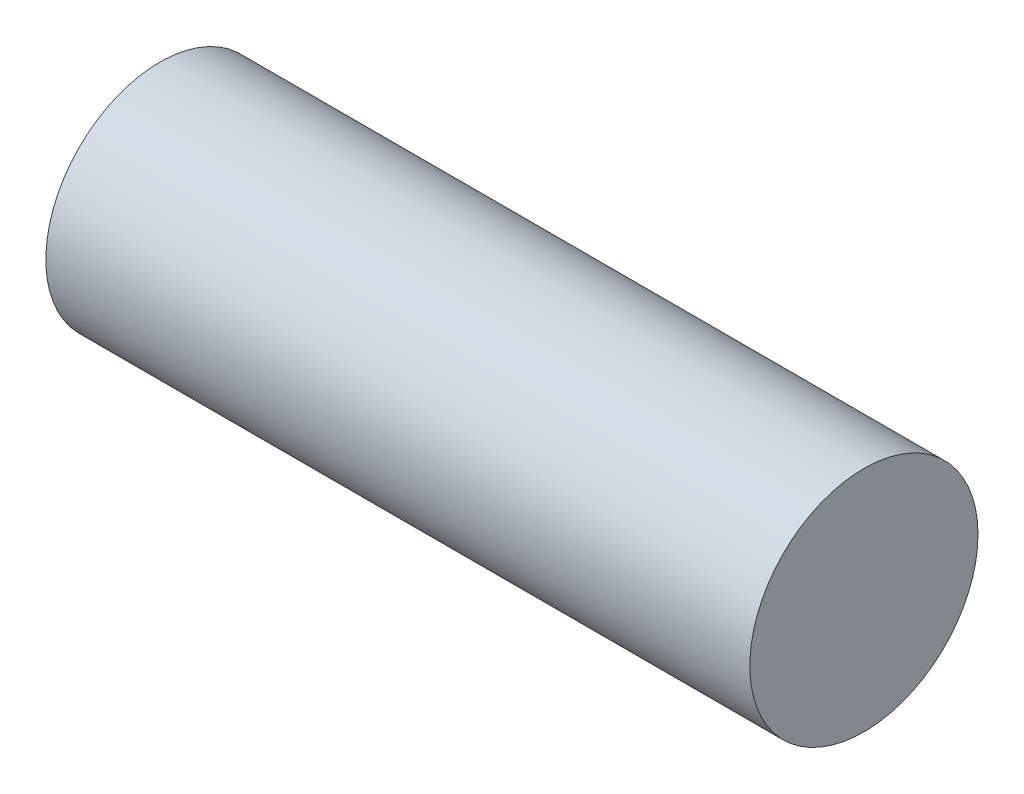
ISO-10303-21;
HEADER;
FILE_DESCRIPTION(('STEP AP214'),'2;1');
FILE_NAME('part.step','',(''),(''),'','','');
FILE_SCHEMA(('AUTOMOTIVE_DESIGN { 1 0 10303 214 1 1 1 1 }'));
ENDSEC;
DATA;
#1=APPLICATION_CONTEXT('core data for automotive mechanical design processes');
#2=APPLICATION_PROTOCOL_DEFINITION('international standard','automotive_design',2000,#1);
#3=PRODUCT_CONTEXT('',#1,'mechanical');
#4=PRODUCT('Part','Part','',(#3));
#5=PRODUCT_RELATED_PRODUCT_CATEGORY('part','',(#4));
#6=PRODUCT_DEFINITION_FORMATION('','',#4);
#7=PRODUCT_DEFINITION_CONTEXT('part definition',#1,'design');
#8=PRODUCT_DEFINITION('design','',#6,#7);
#9=PRODUCT_DEFINITION_SHAPE('','',#8);
#10=(LENGTH_UNIT() NAMED_UNIT(*) SI_UNIT(.MILLI.,.METRE.));
#11=(NAMED_UNIT(*) PLANE_ANGLE_UNIT() SI_UNIT($,.RADIAN.));
#12=(NAMED_UNIT(*) SI_UNIT($,.STERADIAN.) SOLID_ANGLE_UNIT());
#13=UNCERTAINTY_MEASURE_WITH_UNIT(LENGTH_MEASURE(1.E-05),#10,'distance_accuracy_value','');
#14=(GEOMETRIC_REPRESENTATION_CONTEXT(3) GLOBAL_UNCERTAINTY_ASSIGNED_CONTEXT((#13)) GLOBAL_UNIT_ASSIGNED_CONTEXT((#10,
#11,#12)) REPRESENTATION_CONTEXT('',''));
#15=CARTESIAN_POINT('',(0.,0.,0.));
#16=DIRECTION('',(0.,0.,1.));
#17=DIRECTION('',(1.,0.,0.));
#18=AXIS2_PLACEMENT_3D('',#15,#16,#17);
#19=CARTESIAN_POINT('',(35.23,0.,0.));
#20=DIRECTION('',(-1.,0.,0.));
#21=DIRECTION('',(0.,0.,1.));
#22=AXIS2_PLACEMENT_3D('',#19,#20,#21);
#23=CYLINDRICAL_SURFACE('',#22,5.71);
#24=CARTESIAN_POINT('',(35.23,0.,0.));
#25=DIRECTION('',(1.,0.,0.));
#26=DIRECTION('',(0.,0.,-1.));
#27=AXIS2_PLACEMENT_3D('',#24,#25,#26);
#28=CIRCLE('',#27,5.71);
#29=CARTESIAN_POINT('',(35.23,0.,-5.71));
#30=VERTEX_POINT('',#29);
#31=EDGE_CURVE('E10',#30,#30,#28,.T.);
#32=ORIENTED_EDGE('',*,*,#31,.F.);
#33=EDGE_LOOP('',(#32));
#34=FACE_BOUND('',#33,.T.);
#35=CARTESIAN_POINT('',(0.,0.,0.));
#36=DIRECTION('',(1.,0.,0.));
#37=DIRECTION('',(0.,0.,-1.));
#38=AXIS2_PLACEMENT_3D('',#35,#36,#37);
#39=CIRCLE('',#38,5.71);
#40=CARTESIAN_POINT('',(0.,0.,-5.71));
#41=VERTEX_POINT('',#40);
#42=EDGE_CURVE('E45',#41,#41,#39,.T.);
#43=ORIENTED_EDGE('',*,*,#42,.T.);
#44=EDGE_LOOP('',(#43));
#45=FACE_BOUND('',#44,.T.);
#46=ADVANCED_FACE('F42',(#34,#45),#23,.T.);
#47=CARTESIAN_POINT('',(35.23,0.,0.));
#48=DIRECTION('',(1.,0.,0.));
#49=DIRECTION('',(0.,0.,-1.));
#50=AXIS2_PLACEMENT_3D('',#47,#48,#49);
#51=PLANE('',#50);
#52=ORIENTED_EDGE('',*,*,#31,.T.);
#53=EDGE_LOOP('',(#52));
#54=FACE_BOUND('',#53,.T.);
#55=ADVANCED_FACE('F59',(#54),#51,.T.);
#56=CARTESIAN_POINT('',(0.,0.,0.));
#57=DIRECTION('',(1.,0.,0.));
#58=DIRECTION('',(0.,0.,-1.));
#59=AXIS2_PLACEMENT_3D('',#56,#57,#58);
#60=PLANE('',#59);
#61=ORIENTED_EDGE('',*,*,#42,.F.);
#62=EDGE_LOOP('',(#61));
#63=FACE_BOUND('',#62,.T.);
#64=ADVANCED_FACE('F57',(#63),#60,.F.);
#65=CLOSED_SHELL('',(#46,#55,#64));
#66=MANIFOLD_SOLID_BREP('B2',#65);
#67=ADVANCED_BREP_SHAPE_REPRESENTATION('',(#18,#66),#14);
#68=SHAPE_DEFINITION_REPRESENTATION(#9,#67);
ENDSEC;
END-ISO-10303-21;
